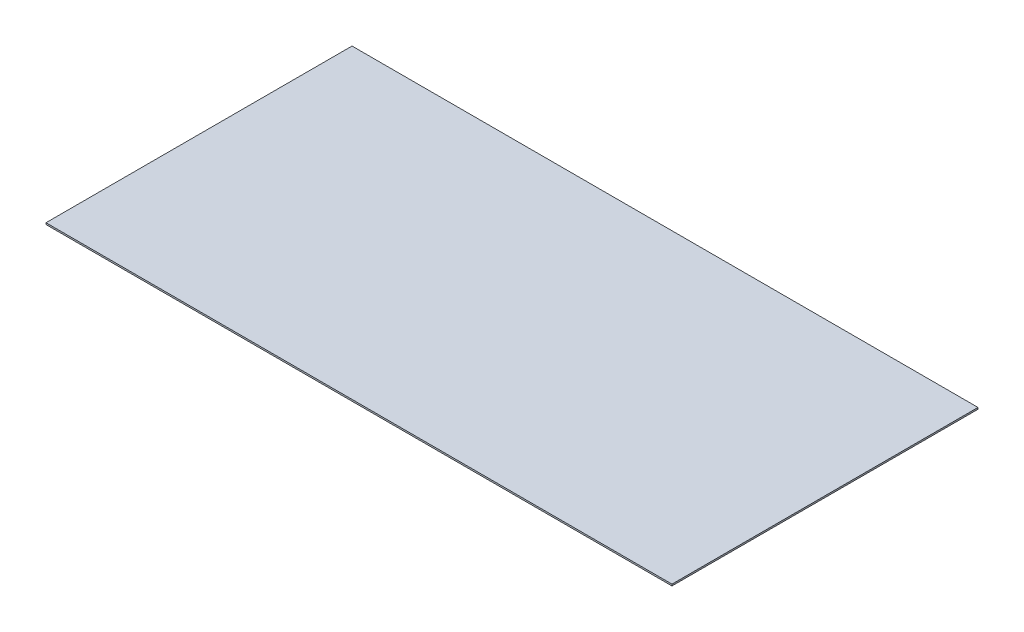
ISO-10303-21;
HEADER;
FILE_DESCRIPTION(('STEP AP214'),'2;1');
FILE_NAME('part.step','',(''),(''),'','','');
FILE_SCHEMA(('AUTOMOTIVE_DESIGN { 1 0 10303 214 1 1 1 1 }'));
ENDSEC;
DATA;
#1=APPLICATION_CONTEXT('core data for automotive mechanical design processes');
#2=APPLICATION_PROTOCOL_DEFINITION('international standard','automotive_design',2000,#1);
#3=PRODUCT_CONTEXT('',#1,'mechanical');
#4=PRODUCT('Part','Part','',(#3));
#5=PRODUCT_RELATED_PRODUCT_CATEGORY('part','',(#4));
#6=PRODUCT_DEFINITION_FORMATION('','',#4);
#7=PRODUCT_DEFINITION_CONTEXT('part definition',#1,'design');
#8=PRODUCT_DEFINITION('design','',#6,#7);
#9=PRODUCT_DEFINITION_SHAPE('','',#8);
#10=(LENGTH_UNIT() NAMED_UNIT(*) SI_UNIT(.MILLI.,.METRE.));
#11=(NAMED_UNIT(*) PLANE_ANGLE_UNIT() SI_UNIT($,.RADIAN.));
#12=(NAMED_UNIT(*) SI_UNIT($,.STERADIAN.) SOLID_ANGLE_UNIT());
#13=UNCERTAINTY_MEASURE_WITH_UNIT(LENGTH_MEASURE(1.E-05),#10,'distance_accuracy_value','');
#14=(GEOMETRIC_REPRESENTATION_CONTEXT(3) GLOBAL_UNCERTAINTY_ASSIGNED_CONTEXT((#13)) GLOBAL_UNIT_ASSIGNED_CONTEXT((#10,
#11,#12)) REPRESENTATION_CONTEXT('',''));
#15=CARTESIAN_POINT('',(0.,0.,0.));
#16=DIRECTION('',(0.,0.,1.));
#17=DIRECTION('',(1.,0.,0.));
#18=AXIS2_PLACEMENT_3D('',#15,#16,#17);
#19=CARTESIAN_POINT('',(120.,-0.710000000000019,66.));
#20=DIRECTION('',(0.,0.,-1.));
#21=DIRECTION('',(-1.,0.,0.));
#22=AXIS2_PLACEMENT_3D('',#19,#20,#21);
#23=PLANE('',#22);
#24=DIRECTION('',(1.,0.,0.));
#25=VECTOR('',#24,1.);
#26=CARTESIAN_POINT('',(0.,-0.7,66.));
#27=LINE('',#26,#25);
#28=CARTESIAN_POINT('',(-150.,-0.7,66.));
#29=VERTEX_POINT('',#28);
#30=CARTESIAN_POINT('',(120.,-0.7,66.));
#31=VERTEX_POINT('',#30);
#32=EDGE_CURVE('E95',#29,#31,#27,.T.);
#33=ORIENTED_EDGE('',*,*,#32,.T.);
#34=DIRECTION('',(0.,1.,0.));
#35=VECTOR('',#34,1.);
#36=CARTESIAN_POINT('',(120.,-0.710000000000019,66.));
#37=LINE('',#36,#35);
#38=CARTESIAN_POINT('',(120.,0.,66.));
#39=VERTEX_POINT('',#38);
#40=EDGE_CURVE('E11',#31,#39,#37,.T.);
#41=ORIENTED_EDGE('',*,*,#40,.T.);
#42=DIRECTION('',(1.,0.,0.));
#43=VECTOR('',#42,1.);
#44=CARTESIAN_POINT('',(0.,0.,66.));
#45=LINE('',#44,#43);
#46=CARTESIAN_POINT('',(-150.,0.,66.));
#47=VERTEX_POINT('',#46);
#48=EDGE_CURVE('E102',#47,#39,#45,.T.);
#49=ORIENTED_EDGE('',*,*,#48,.F.);
#50=DIRECTION('',(0.,-1.,0.));
#51=VECTOR('',#50,1.);
#52=CARTESIAN_POINT('',(-150.,-0.7,66.));
#53=LINE('',#52,#51);
#54=EDGE_CURVE('E61',#47,#29,#53,.T.);
#55=ORIENTED_EDGE('',*,*,#54,.T.);
#56=EDGE_LOOP('',(#33,#41,#49,#55));
#57=FACE_BOUND('',#56,.T.);
#58=ADVANCED_FACE('F36',(#57),#23,.F.);
#59=CARTESIAN_POINT('',(-150.,-0.710000000000019,-66.));
#60=DIRECTION('',(0.,0.,1.));
#61=DIRECTION('',(1.,0.,0.));
#62=AXIS2_PLACEMENT_3D('',#59,#60,#61);
#63=PLANE('',#62);
#64=DIRECTION('',(-1.,0.,0.));
#65=VECTOR('',#64,1.);
#66=CARTESIAN_POINT('',(0.,-0.7,-66.));
#67=LINE('',#66,#65);
#68=CARTESIAN_POINT('',(120.,-0.7,-66.));
#69=VERTEX_POINT('',#68);
#70=CARTESIAN_POINT('',(-150.,-0.7,-66.));
#71=VERTEX_POINT('',#70);
#72=EDGE_CURVE('E82',#69,#71,#67,.T.);
#73=ORIENTED_EDGE('',*,*,#72,.T.);
#74=DIRECTION('',(0.,1.,0.));
#75=VECTOR('',#74,1.);
#76=CARTESIAN_POINT('',(-150.,-0.7,-66.));
#77=LINE('',#76,#75);
#78=CARTESIAN_POINT('',(-150.,0.,-66.));
#79=VERTEX_POINT('',#78);
#80=EDGE_CURVE('E96',#71,#79,#77,.T.);
#81=ORIENTED_EDGE('',*,*,#80,.T.);
#82=DIRECTION('',(-1.,0.,0.));
#83=VECTOR('',#82,1.);
#84=CARTESIAN_POINT('',(0.,0.,-66.));
#85=LINE('',#84,#83);
#86=CARTESIAN_POINT('',(120.,0.,-66.));
#87=VERTEX_POINT('',#86);
#88=EDGE_CURVE('E53',#87,#79,#85,.T.);
#89=ORIENTED_EDGE('',*,*,#88,.F.);
#90=DIRECTION('',(0.,1.,0.));
#91=VECTOR('',#90,1.);
#92=CARTESIAN_POINT('',(120.,-0.710000000000019,-66.));
#93=LINE('',#92,#91);
#94=EDGE_CURVE('E45',#69,#87,#93,.T.);
#95=ORIENTED_EDGE('',*,*,#94,.F.);
#96=EDGE_LOOP('',(#73,#81,#89,#95));
#97=FACE_BOUND('',#96,.T.);
#98=ADVANCED_FACE('F38',(#97),#63,.F.);
#99=CARTESIAN_POINT('',(120.,-0.710000000000019,-66.));
#100=DIRECTION('',(-1.,0.,0.));
#101=DIRECTION('',(0.,0.,1.));
#102=AXIS2_PLACEMENT_3D('',#99,#100,#101);
#103=PLANE('',#102);
#104=DIRECTION('',(0.,0.,-1.));
#105=VECTOR('',#104,1.);
#106=CARTESIAN_POINT('',(120.,-0.7,0.));
#107=LINE('',#106,#105);
#108=EDGE_CURVE('E40',#31,#69,#107,.T.);
#109=ORIENTED_EDGE('',*,*,#108,.T.);
#110=ORIENTED_EDGE('',*,*,#94,.T.);
#111=DIRECTION('',(0.,0.,-1.));
#112=VECTOR('',#111,1.);
#113=CARTESIAN_POINT('',(120.,0.,0.));
#114=LINE('',#113,#112);
#115=EDGE_CURVE('E103',#39,#87,#114,.T.);
#116=ORIENTED_EDGE('',*,*,#115,.F.);
#117=ORIENTED_EDGE('',*,*,#40,.F.);
#118=EDGE_LOOP('',(#109,#110,#116,#117));
#119=FACE_BOUND('',#118,.T.);
#120=ADVANCED_FACE('F94',(#119),#103,.F.);
#121=CARTESIAN_POINT('',(0.,-0.7,0.));
#122=DIRECTION('',(0.,-1.,0.));
#123=DIRECTION('',(0.,0.,-1.));
#124=AXIS2_PLACEMENT_3D('',#121,#122,#123);
#125=PLANE('',#124);
#126=ORIENTED_EDGE('',*,*,#72,.F.);
#127=ORIENTED_EDGE('',*,*,#108,.F.);
#128=ORIENTED_EDGE('',*,*,#32,.F.);
#129=DIRECTION('',(0.,0.,1.));
#130=VECTOR('',#129,1.);
#131=CARTESIAN_POINT('',(-150.,-0.7,71.));
#132=LINE('',#131,#130);
#133=EDGE_CURVE('E87',#71,#29,#132,.T.);
#134=ORIENTED_EDGE('',*,*,#133,.F.);
#135=EDGE_LOOP('',(#126,#127,#128,#134));
#136=FACE_BOUND('',#135,.T.);
#137=ADVANCED_FACE('F84',(#136),#125,.T.);
#138=CARTESIAN_POINT('',(0.,0.,0.));
#139=DIRECTION('',(0.,-1.,0.));
#140=DIRECTION('',(0.,0.,-1.));
#141=AXIS2_PLACEMENT_3D('',#138,#139,#140);
#142=PLANE('',#141);
#143=ORIENTED_EDGE('',*,*,#115,.T.);
#144=ORIENTED_EDGE('',*,*,#88,.T.);
#145=DIRECTION('',(0.,0.,1.));
#146=VECTOR('',#145,1.);
#147=CARTESIAN_POINT('',(-150.,0.,71.));
#148=LINE('',#147,#146);
#149=EDGE_CURVE('E107',#79,#47,#148,.T.);
#150=ORIENTED_EDGE('',*,*,#149,.T.);
#151=ORIENTED_EDGE('',*,*,#48,.T.);
#152=EDGE_LOOP('',(#143,#144,#150,#151));
#153=FACE_BOUND('',#152,.T.);
#154=ADVANCED_FACE('F110',(#153),#142,.F.);
#155=CARTESIAN_POINT('',(-150.,-0.7,71.));
#156=DIRECTION('',(-1.,0.,0.));
#157=DIRECTION('',(0.,0.,1.));
#158=AXIS2_PLACEMENT_3D('',#155,#156,#157);
#159=PLANE('',#158);
#160=ORIENTED_EDGE('',*,*,#80,.F.);
#161=ORIENTED_EDGE('',*,*,#133,.T.);
#162=ORIENTED_EDGE('',*,*,#54,.F.);
#163=ORIENTED_EDGE('',*,*,#149,.F.);
#164=EDGE_LOOP('',(#160,#161,#162,#163));
#165=FACE_BOUND('',#164,.T.);
#166=ADVANCED_FACE('F109',(#165),#159,.T.);
#167=CLOSED_SHELL('',(#58,#98,#120,#137,#154,#166));
#168=MANIFOLD_SOLID_BREP('B2',#167);
#169=ADVANCED_BREP_SHAPE_REPRESENTATION('',(#18,#168),#14);
#170=SHAPE_DEFINITION_REPRESENTATION(#9,#169);
ENDSEC;
END-ISO-10303-21;
